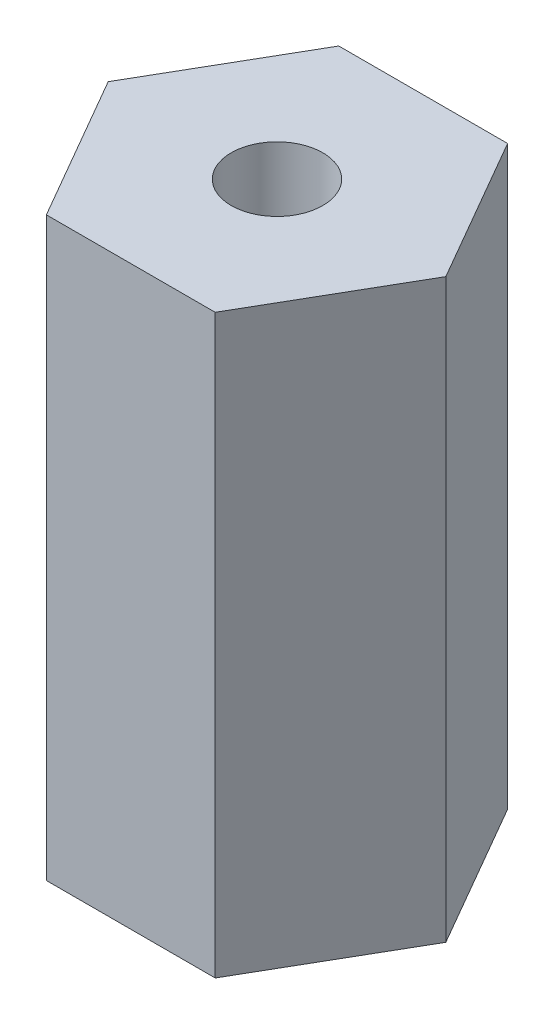
ISO-10303-21;
HEADER;
FILE_DESCRIPTION(('STEP AP214'),'2;1');
FILE_NAME('part.step','',(''),(''),'','','');
FILE_SCHEMA(('AUTOMOTIVE_DESIGN { 1 0 10303 214 1 1 1 1 }'));
ENDSEC;
DATA;
#1=APPLICATION_CONTEXT('core data for automotive mechanical design processes');
#2=APPLICATION_PROTOCOL_DEFINITION('international standard','automotive_design',2000,#1);
#3=PRODUCT_CONTEXT('',#1,'mechanical');
#4=PRODUCT('Part','Part','',(#3));
#5=PRODUCT_RELATED_PRODUCT_CATEGORY('part','',(#4));
#6=PRODUCT_DEFINITION_FORMATION('','',#4);
#7=PRODUCT_DEFINITION_CONTEXT('part definition',#1,'design');
#8=PRODUCT_DEFINITION('design','',#6,#7);
#9=PRODUCT_DEFINITION_SHAPE('','',#8);
#10=(LENGTH_UNIT() NAMED_UNIT(*) SI_UNIT(.MILLI.,.METRE.));
#11=(NAMED_UNIT(*) PLANE_ANGLE_UNIT() SI_UNIT($,.RADIAN.));
#12=(NAMED_UNIT(*) SI_UNIT($,.STERADIAN.) SOLID_ANGLE_UNIT());
#13=UNCERTAINTY_MEASURE_WITH_UNIT(LENGTH_MEASURE(1.E-05),#10,'distance_accuracy_value','');
#14=(GEOMETRIC_REPRESENTATION_CONTEXT(3) GLOBAL_UNCERTAINTY_ASSIGNED_CONTEXT((#13)) GLOBAL_UNIT_ASSIGNED_CONTEXT((#10,
#11,#12)) REPRESENTATION_CONTEXT('',''));
#15=CARTESIAN_POINT('',(0.,0.,0.));
#16=DIRECTION('',(0.,0.,1.));
#17=DIRECTION('',(1.,0.,0.));
#18=AXIS2_PLACEMENT_3D('',#15,#16,#17);
#19=CARTESIAN_POINT('',(3.66040070666223,12.5,6.34));
#20=DIRECTION('',(-0.866025403784439,0.,-0.5));
#21=DIRECTION('',(-0.5,0.,0.866025403784439));
#22=AXIS2_PLACEMENT_3D('',#19,#20,#21);
#23=PLANE('',#22);
#24=DIRECTION('',(0.5,0.,-0.866025403784439));
#25=VECTOR('',#24,1.);
#26=CARTESIAN_POINT('',(3.66040070666223,-12.5,6.34));
#27=LINE('',#26,#25);
#28=CARTESIAN_POINT('',(3.66040070666223,-12.5,6.34));
#29=VERTEX_POINT('',#28);
#30=CARTESIAN_POINT('',(7.32080141332446,-12.5,0.));
#31=VERTEX_POINT('',#30);
#32=EDGE_CURVE('E117',#29,#31,#27,.T.);
#33=ORIENTED_EDGE('',*,*,#32,.T.);
#34=DIRECTION('',(0.,-1.,0.));
#35=VECTOR('',#34,1.);
#36=CARTESIAN_POINT('',(7.32080141332446,12.5,0.));
#37=LINE('',#36,#35);
#38=CARTESIAN_POINT('',(7.32080141332446,12.5,0.));
#39=VERTEX_POINT('',#38);
#40=EDGE_CURVE('E11',#39,#31,#37,.T.);
#41=ORIENTED_EDGE('',*,*,#40,.F.);
#42=DIRECTION('',(0.5,0.,-0.866025403784439));
#43=VECTOR('',#42,1.);
#44=CARTESIAN_POINT('',(3.66040070666223,12.5,6.34));
#45=LINE('',#44,#43);
#46=CARTESIAN_POINT('',(3.66040070666223,12.5,6.34));
#47=VERTEX_POINT('',#46);
#48=EDGE_CURVE('E128',#47,#39,#45,.T.);
#49=ORIENTED_EDGE('',*,*,#48,.F.);
#50=DIRECTION('',(0.,-1.,0.));
#51=VECTOR('',#50,1.);
#52=CARTESIAN_POINT('',(3.66040070666223,12.5,6.34));
#53=LINE('',#52,#51);
#54=EDGE_CURVE('E113',#47,#29,#53,.T.);
#55=ORIENTED_EDGE('',*,*,#54,.T.);
#56=EDGE_LOOP('',(#33,#41,#49,#55));
#57=FACE_BOUND('',#56,.T.);
#58=ADVANCED_FACE('F33',(#57),#23,.F.);
#59=CARTESIAN_POINT('',(7.32080141332446,12.5,0.));
#60=DIRECTION('',(-0.866025403784438,0.,0.5));
#61=DIRECTION('',(0.5,0.,0.866025403784438));
#62=AXIS2_PLACEMENT_3D('',#59,#60,#61);
#63=PLANE('',#62);
#64=DIRECTION('',(-0.5,0.,-0.866025403784438));
#65=VECTOR('',#64,1.);
#66=CARTESIAN_POINT('',(7.32080141332446,-12.5,0.));
#67=LINE('',#66,#65);
#68=CARTESIAN_POINT('',(3.66040070666223,-12.5,-6.34));
#69=VERTEX_POINT('',#68);
#70=EDGE_CURVE('E120',#31,#69,#67,.T.);
#71=ORIENTED_EDGE('',*,*,#70,.T.);
#72=DIRECTION('',(0.,-1.,0.));
#73=VECTOR('',#72,1.);
#74=CARTESIAN_POINT('',(3.66040070666223,12.5,-6.34));
#75=LINE('',#74,#73);
#76=CARTESIAN_POINT('',(3.66040070666223,12.5,-6.34));
#77=VERTEX_POINT('',#76);
#78=EDGE_CURVE('E41',#77,#69,#75,.T.);
#79=ORIENTED_EDGE('',*,*,#78,.F.);
#80=DIRECTION('',(-0.5,0.,-0.866025403784438));
#81=VECTOR('',#80,1.);
#82=CARTESIAN_POINT('',(7.32080141332446,12.5,0.));
#83=LINE('',#82,#81);
#84=EDGE_CURVE('E86',#39,#77,#83,.T.);
#85=ORIENTED_EDGE('',*,*,#84,.F.);
#86=ORIENTED_EDGE('',*,*,#40,.T.);
#87=EDGE_LOOP('',(#71,#79,#85,#86));
#88=FACE_BOUND('',#87,.T.);
#89=ADVANCED_FACE('F153',(#88),#63,.F.);
#90=CARTESIAN_POINT('',(3.66040070666223,12.5,-6.34));
#91=DIRECTION('',(0.,0.,1.));
#92=DIRECTION('',(1.,0.,0.));
#93=AXIS2_PLACEMENT_3D('',#90,#91,#92);
#94=PLANE('',#93);
#95=DIRECTION('',(-1.,0.,0.));
#96=VECTOR('',#95,1.);
#97=CARTESIAN_POINT('',(3.66040070666223,-12.5,-6.34));
#98=LINE('',#97,#96);
#99=CARTESIAN_POINT('',(-3.66040070666223,-12.5,-6.34));
#100=VERTEX_POINT('',#99);
#101=EDGE_CURVE('E123',#69,#100,#98,.T.);
#102=ORIENTED_EDGE('',*,*,#101,.T.);
#103=DIRECTION('',(0.,-1.,0.));
#104=VECTOR('',#103,1.);
#105=CARTESIAN_POINT('',(-3.66040070666223,12.5,-6.34));
#106=LINE('',#105,#104);
#107=CARTESIAN_POINT('',(-3.66040070666223,12.5,-6.34));
#108=VERTEX_POINT('',#107);
#109=EDGE_CURVE('E108',#108,#100,#106,.T.);
#110=ORIENTED_EDGE('',*,*,#109,.F.);
#111=DIRECTION('',(-1.,0.,0.));
#112=VECTOR('',#111,1.);
#113=CARTESIAN_POINT('',(3.66040070666223,12.5,-6.34));
#114=LINE('',#113,#112);
#115=EDGE_CURVE('E99',#77,#108,#114,.T.);
#116=ORIENTED_EDGE('',*,*,#115,.F.);
#117=ORIENTED_EDGE('',*,*,#78,.T.);
#118=EDGE_LOOP('',(#102,#110,#116,#117));
#119=FACE_BOUND('',#118,.T.);
#120=ADVANCED_FACE('F134',(#119),#94,.F.);
#121=CARTESIAN_POINT('',(-3.66040070666223,12.5,-6.34));
#122=DIRECTION('',(0.866025403784439,0.,0.5));
#123=DIRECTION('',(0.5,0.,-0.866025403784439));
#124=AXIS2_PLACEMENT_3D('',#121,#122,#123);
#125=PLANE('',#124);
#126=DIRECTION('',(-0.5,0.,0.866025403784439));
#127=VECTOR('',#126,1.);
#128=CARTESIAN_POINT('',(-3.66040070666223,-12.5,-6.34));
#129=LINE('',#128,#127);
#130=CARTESIAN_POINT('',(-7.32080141332445,-12.5,0.));
#131=VERTEX_POINT('',#130);
#132=EDGE_CURVE('E107',#100,#131,#129,.T.);
#133=ORIENTED_EDGE('',*,*,#132,.T.);
#134=DIRECTION('',(0.,-1.,0.));
#135=VECTOR('',#134,1.);
#136=CARTESIAN_POINT('',(-7.32080141332445,12.5,0.));
#137=LINE('',#136,#135);
#138=CARTESIAN_POINT('',(-7.32080141332445,12.5,0.));
#139=VERTEX_POINT('',#138);
#140=EDGE_CURVE('E104',#139,#131,#137,.T.);
#141=ORIENTED_EDGE('',*,*,#140,.F.);
#142=DIRECTION('',(-0.5,0.,0.866025403784439));
#143=VECTOR('',#142,1.);
#144=CARTESIAN_POINT('',(-3.66040070666223,12.5,-6.34));
#145=LINE('',#144,#143);
#146=EDGE_CURVE('E93',#108,#139,#145,.T.);
#147=ORIENTED_EDGE('',*,*,#146,.F.);
#148=ORIENTED_EDGE('',*,*,#109,.T.);
#149=EDGE_LOOP('',(#133,#141,#147,#148));
#150=FACE_BOUND('',#149,.T.);
#151=ADVANCED_FACE('F105',(#150),#125,.F.);
#152=CARTESIAN_POINT('',(-7.32080141332445,12.5,0.));
#153=DIRECTION('',(0.866025403784438,0.,-0.5));
#154=DIRECTION('',(-0.5,0.,-0.866025403784438));
#155=AXIS2_PLACEMENT_3D('',#152,#153,#154);
#156=PLANE('',#155);
#157=DIRECTION('',(0.5,0.,0.866025403784438));
#158=VECTOR('',#157,1.);
#159=CARTESIAN_POINT('',(-7.32080141332445,-12.5,0.));
#160=LINE('',#159,#158);
#161=CARTESIAN_POINT('',(-3.66040070666222,-12.5,6.34));
#162=VERTEX_POINT('',#161);
#163=EDGE_CURVE('E72',#131,#162,#160,.T.);
#164=ORIENTED_EDGE('',*,*,#163,.T.);
#165=DIRECTION('',(0.,-1.,0.));
#166=VECTOR('',#165,1.);
#167=CARTESIAN_POINT('',(-3.66040070666222,12.5,6.34));
#168=LINE('',#167,#166);
#169=CARTESIAN_POINT('',(-3.66040070666222,12.5,6.34));
#170=VERTEX_POINT('',#169);
#171=EDGE_CURVE('E109',#170,#162,#168,.T.);
#172=ORIENTED_EDGE('',*,*,#171,.F.);
#173=DIRECTION('',(0.5,0.,0.866025403784438));
#174=VECTOR('',#173,1.);
#175=CARTESIAN_POINT('',(-7.32080141332445,12.5,0.));
#176=LINE('',#175,#174);
#177=EDGE_CURVE('E97',#139,#170,#176,.T.);
#178=ORIENTED_EDGE('',*,*,#177,.F.);
#179=ORIENTED_EDGE('',*,*,#140,.T.);
#180=EDGE_LOOP('',(#164,#172,#178,#179));
#181=FACE_BOUND('',#180,.T.);
#182=ADVANCED_FACE('F111',(#181),#156,.F.);
#183=CARTESIAN_POINT('',(-3.66040070666222,12.5,6.34));
#184=DIRECTION('',(0.,0.,-1.));
#185=DIRECTION('',(-1.,0.,0.));
#186=AXIS2_PLACEMENT_3D('',#183,#184,#185);
#187=PLANE('',#186);
#188=DIRECTION('',(1.,0.,0.));
#189=VECTOR('',#188,1.);
#190=CARTESIAN_POINT('',(-3.66040070666222,-12.5,6.34));
#191=LINE('',#190,#189);
#192=EDGE_CURVE('E78',#162,#29,#191,.T.);
#193=ORIENTED_EDGE('',*,*,#192,.T.);
#194=ORIENTED_EDGE('',*,*,#54,.F.);
#195=DIRECTION('',(1.,0.,0.));
#196=VECTOR('',#195,1.);
#197=CARTESIAN_POINT('',(-3.66040070666222,12.5,6.34));
#198=LINE('',#197,#196);
#199=EDGE_CURVE('E49',#170,#47,#198,.T.);
#200=ORIENTED_EDGE('',*,*,#199,.F.);
#201=ORIENTED_EDGE('',*,*,#171,.T.);
#202=EDGE_LOOP('',(#193,#194,#200,#201));
#203=FACE_BOUND('',#202,.T.);
#204=ADVANCED_FACE('F141',(#203),#187,.F.);
#205=CARTESIAN_POINT('',(0.,12.5,0.));
#206=DIRECTION('',(0.,1.,0.));
#207=DIRECTION('',(0.,0.,1.));
#208=AXIS2_PLACEMENT_3D('',#205,#206,#207);
#209=PLANE('',#208);
#210=CARTESIAN_POINT('',(0.,12.5,0.));
#211=DIRECTION('',(0.,1.,0.));
#212=DIRECTION('',(0.,0.,1.));
#213=AXIS2_PLACEMENT_3D('',#210,#211,#212);
#214=CIRCLE('',#213,1.985);
#215=CARTESIAN_POINT('',(0.,12.5,1.985));
#216=VERTEX_POINT('',#215);
#217=EDGE_CURVE('E208',#216,#216,#214,.T.);
#218=ORIENTED_EDGE('',*,*,#217,.F.);
#219=EDGE_LOOP('',(#218));
#220=FACE_BOUND('',#219,.T.);
#221=ORIENTED_EDGE('',*,*,#48,.T.);
#222=ORIENTED_EDGE('',*,*,#84,.T.);
#223=ORIENTED_EDGE('',*,*,#115,.T.);
#224=ORIENTED_EDGE('',*,*,#146,.T.);
#225=ORIENTED_EDGE('',*,*,#177,.T.);
#226=ORIENTED_EDGE('',*,*,#199,.T.);
#227=EDGE_LOOP('',(#221,#222,#223,#224,#225,#226));
#228=FACE_BOUND('',#227,.T.);
#229=ADVANCED_FACE('F95',(#220,#228),#209,.T.);
#230=CARTESIAN_POINT('',(0.,-12.5,0.));
#231=DIRECTION('',(0.,1.,0.));
#232=DIRECTION('',(0.,0.,1.));
#233=AXIS2_PLACEMENT_3D('',#230,#231,#232);
#234=PLANE('',#233);
#235=CARTESIAN_POINT('',(0.,-12.5,0.));
#236=DIRECTION('',(0.,1.,0.));
#237=DIRECTION('',(0.,0.,1.));
#238=AXIS2_PLACEMENT_3D('',#235,#236,#237);
#239=CIRCLE('',#238,1.985);
#240=CARTESIAN_POINT('',(0.,-12.5,1.985));
#241=VERTEX_POINT('',#240);
#242=EDGE_CURVE('E121',#241,#241,#239,.T.);
#243=ORIENTED_EDGE('',*,*,#242,.T.);
#244=EDGE_LOOP('',(#243));
#245=FACE_BOUND('',#244,.T.);
#246=ORIENTED_EDGE('',*,*,#32,.F.);
#247=ORIENTED_EDGE('',*,*,#192,.F.);
#248=ORIENTED_EDGE('',*,*,#163,.F.);
#249=ORIENTED_EDGE('',*,*,#132,.F.);
#250=ORIENTED_EDGE('',*,*,#101,.F.);
#251=ORIENTED_EDGE('',*,*,#70,.F.);
#252=EDGE_LOOP('',(#246,#247,#248,#249,#250,#251));
#253=FACE_BOUND('',#252,.T.);
#254=ADVANCED_FACE('F137',(#245,#253),#234,.F.);
#255=CARTESIAN_POINT('',(0.,-12.5,0.));
#256=DIRECTION('',(0.,1.,0.));
#257=DIRECTION('',(0.,0.,1.));
#258=AXIS2_PLACEMENT_3D('',#255,#256,#257);
#259=CYLINDRICAL_SURFACE('',#258,1.985);
#260=ORIENTED_EDGE('',*,*,#242,.F.);
#261=EDGE_LOOP('',(#260));
#262=FACE_BOUND('',#261,.T.);
#263=ORIENTED_EDGE('',*,*,#217,.T.);
#264=EDGE_LOOP('',(#263));
#265=FACE_BOUND('',#264,.T.);
#266=ADVANCED_FACE('F190',(#262,#265),#259,.F.);
#267=CLOSED_SHELL('',(#58,#89,#120,#151,#182,#204,#229,#254,#266));
#268=MANIFOLD_SOLID_BREP('B2',#267);
#269=ADVANCED_BREP_SHAPE_REPRESENTATION('',(#18,#268),#14);
#270=SHAPE_DEFINITION_REPRESENTATION(#9,#269);
ENDSEC;
END-ISO-10303-21;
